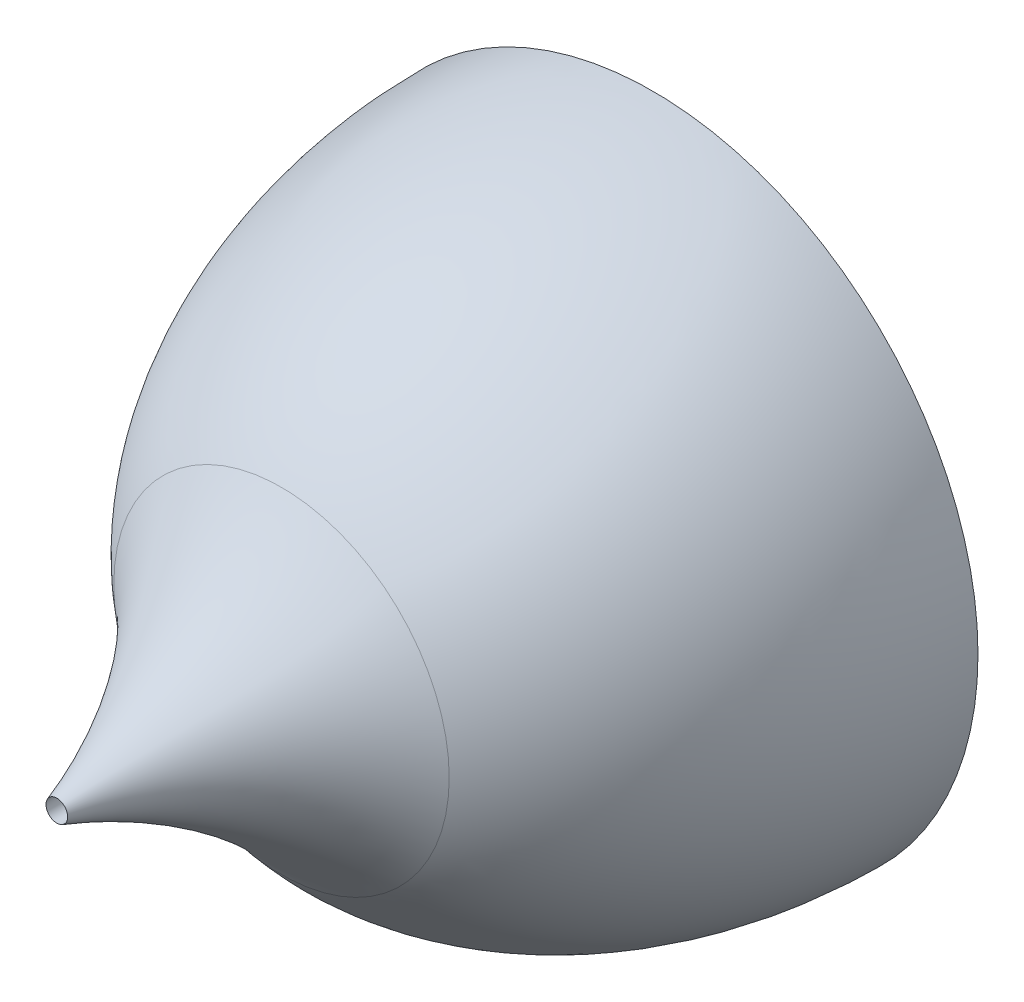
ISO-10303-21;
HEADER;
FILE_DESCRIPTION(('STEP AP214'),'2;1');
FILE_NAME('part.step','',(''),(''),'','','');
FILE_SCHEMA(('AUTOMOTIVE_DESIGN { 1 0 10303 214 1 1 1 1 }'));
ENDSEC;
DATA;
#1=APPLICATION_CONTEXT('core data for automotive mechanical design processes');
#2=APPLICATION_PROTOCOL_DEFINITION('international standard','automotive_design',2000,#1);
#3=PRODUCT_CONTEXT('',#1,'mechanical');
#4=PRODUCT('Part','Part','',(#3));
#5=PRODUCT_RELATED_PRODUCT_CATEGORY('part','',(#4));
#6=PRODUCT_DEFINITION_FORMATION('','',#4);
#7=PRODUCT_DEFINITION_CONTEXT('part definition',#1,'design');
#8=PRODUCT_DEFINITION('design','',#6,#7);
#9=PRODUCT_DEFINITION_SHAPE('','',#8);
#10=(LENGTH_UNIT() NAMED_UNIT(*) SI_UNIT(.MILLI.,.METRE.));
#11=(NAMED_UNIT(*) PLANE_ANGLE_UNIT() SI_UNIT($,.RADIAN.));
#12=(NAMED_UNIT(*) SI_UNIT($,.STERADIAN.) SOLID_ANGLE_UNIT());
#13=UNCERTAINTY_MEASURE_WITH_UNIT(LENGTH_MEASURE(1.E-05),#10,'distance_accuracy_value','');
#14=(GEOMETRIC_REPRESENTATION_CONTEXT(3) GLOBAL_UNCERTAINTY_ASSIGNED_CONTEXT((#13)) GLOBAL_UNIT_ASSIGNED_CONTEXT((#10,
#11,#12)) REPRESENTATION_CONTEXT('',''));
#15=CARTESIAN_POINT('',(0.,0.,0.));
#16=DIRECTION('',(0.,0.,1.));
#17=DIRECTION('',(1.,0.,0.));
#18=AXIS2_PLACEMENT_3D('',#15,#16,#17);
#19=CARTESIAN_POINT('',(0.,0.,0.));
#20=DIRECTION('',(0.,-1.,0.));
#21=DIRECTION('',(0.,0.,-1.));
#22=AXIS2_PLACEMENT_3D('',#19,#20,#21);
#23=ELLIPSE('',#22,17.,12.);
#24=TRIMMED_CURVE('',#23,(PARAMETER_VALUE(3.14159265358979)),
(PARAMETER_VALUE(6.28318530717959)),.T.,.PARAMETER.);
#25=CARTESIAN_POINT('',(0.,0.,-24.4808982426712));
#26=DIRECTION('',(0.,0.,-1.));
#27=AXIS1_PLACEMENT('',#25,#26);
#28=SURFACE_OF_REVOLUTION('',#24,#27);
#29=CARTESIAN_POINT('',(0.,0.,0.));
#30=DIRECTION('',(0.,0.,-1.));
#31=DIRECTION('',(-1.,0.,0.));
#32=AXIS2_PLACEMENT_3D('',#29,#30,#31);
#33=CIRCLE('',#32,12.);
#34=CARTESIAN_POINT('',(-12.,0.,0.));
#35=VERTEX_POINT('',#34);
#36=EDGE_CURVE('E10',#35,#35,#33,.T.);
#37=ORIENTED_EDGE('',*,*,#36,.T.);
#38=EDGE_LOOP('',(#37));
#39=FACE_BOUND('',#38,.T.);
#40=CARTESIAN_POINT('',(0.,0.,16.9852366450659));
#41=DIRECTION('',(0.,0.,-1.));
#42=DIRECTION('',(-1.,0.,0.));
#43=AXIS2_PLACEMENT_3D('',#40,#41,#42);
#44=CIRCLE('',#43,0.500000000000001);
#45=CARTESIAN_POINT('',(-0.5,0.,16.9852366450659));
#46=VERTEX_POINT('',#45);
#47=EDGE_CURVE('E50',#46,#46,#44,.T.);
#48=ORIENTED_EDGE('',*,*,#47,.F.);
#49=EDGE_LOOP('',(#48));
#50=FACE_BOUND('',#49,.T.);
#51=ADVANCED_FACE('F30',(#39,#50),#28,.F.);
#52=CARTESIAN_POINT('',(-15.,0.,0.));
#53=DIRECTION('',(0.,0.,-1.));
#54=DIRECTION('',(-1.,0.,0.));
#55=AXIS2_PLACEMENT_3D('',#52,#53,#54);
#56=PLANE('',#55);
#57=CARTESIAN_POINT('',(0.,0.,0.));
#58=DIRECTION('',(0.,0.,-1.));
#59=DIRECTION('',(-1.,0.,0.));
#60=AXIS2_PLACEMENT_3D('',#57,#58,#59);
#61=CIRCLE('',#60,15.);
#62=CARTESIAN_POINT('',(-15.,0.,0.));
#63=VERTEX_POINT('',#62);
#64=EDGE_CURVE('E37',#63,#63,#61,.T.);
#65=ORIENTED_EDGE('',*,*,#64,.T.);
#66=EDGE_LOOP('',(#65));
#67=FACE_BOUND('',#66,.T.);
#68=ORIENTED_EDGE('',*,*,#36,.F.);
#69=EDGE_LOOP('',(#68));
#70=FACE_BOUND('',#69,.T.);
#71=ADVANCED_FACE('F60',(#67,#70),#56,.T.);
#72=CARTESIAN_POINT('',(0.,0.,0.));
#73=DIRECTION('',(0.,1.,0.));
#74=DIRECTION('',(0.,0.,1.));
#75=AXIS2_PLACEMENT_3D('',#72,#73,#74);
#76=ELLIPSE('',#75,20.,15.);
#77=TRIMMED_CURVE('',#76,(PARAMETER_VALUE(3.14159265358979)),
(PARAMETER_VALUE(6.28318530717959)),.T.,.PARAMETER.);
#78=CARTESIAN_POINT('',(0.,0.,-24.4808982426712));
#79=DIRECTION('',(0.,0.,-1.));
#80=AXIS1_PLACEMENT('',#78,#79);
#81=SURFACE_OF_REVOLUTION('',#77,#80);
#82=CARTESIAN_POINT('',(0.,0.,17.1335443860057));
#83=DIRECTION('',(0.,0.,-1.));
#84=DIRECTION('',(-1.,0.,0.));
#85=AXIS2_PLACEMENT_3D('',#82,#83,#84);
#86=CIRCLE('',#85,7.73779244582623);
#87=CARTESIAN_POINT('',(-7.73779244582623,0.,17.1335443860057));
#88=VERTEX_POINT('',#87);
#89=EDGE_CURVE('E41',#88,#88,#86,.T.);
#90=ORIENTED_EDGE('',*,*,#89,.T.);
#91=EDGE_LOOP('',(#90));
#92=FACE_BOUND('',#91,.T.);
#93=ORIENTED_EDGE('',*,*,#64,.F.);
#94=EDGE_LOOP('',(#93));
#95=FACE_BOUND('',#94,.T.);
#96=ADVANCED_FACE('F56',(#92,#95),#81,.F.);
#97=CARTESIAN_POINT('',(0.,0.,34.6784694956438));
#98=DIRECTION('',(0.,0.,-1.));
#99=DIRECTION('',(-1.,0.,0.));
#100=AXIS2_PLACEMENT_3D('',#97,#98,#99);
#101=DEGENERATE_TOROIDAL_SURFACE('',#100,21.8241547476126,22.5000000000002,.T.);
#102=CARTESIAN_POINT('',(0.,0.,27.5000000000001));
#103=DIRECTION('',(0.,0.,-1.));
#104=DIRECTION('',(-1.,0.,0.));
#105=AXIS2_PLACEMENT_3D('',#102,#103,#104);
#106=CIRCLE('',#105,0.500000000000192);
#107=CARTESIAN_POINT('',(-0.500000000000191,0.,27.5000000000001));
#108=VERTEX_POINT('',#107);
#109=EDGE_CURVE('E45',#108,#108,#106,.T.);
#110=ORIENTED_EDGE('',*,*,#109,.T.);
#111=EDGE_LOOP('',(#110));
#112=FACE_BOUND('',#111,.T.);
#113=ORIENTED_EDGE('',*,*,#89,.F.);
#114=EDGE_LOOP('',(#113));
#115=FACE_BOUND('',#114,.T.);
#116=ADVANCED_FACE('F59',(#112,#115),#101,.F.);
#117=CARTESIAN_POINT('',(0.,0.,-24.4808982426712));
#118=DIRECTION('',(0.,0.,-1.));
#119=DIRECTION('',(-1.,0.,0.));
#120=AXIS2_PLACEMENT_3D('',#117,#118,#119);
#121=CYLINDRICAL_SURFACE('',#120,0.500000000000097);
#122=ORIENTED_EDGE('',*,*,#47,.T.);
#123=EDGE_LOOP('',(#122));
#124=FACE_BOUND('',#123,.T.);
#125=ORIENTED_EDGE('',*,*,#109,.F.);
#126=EDGE_LOOP('',(#125));
#127=FACE_BOUND('',#126,.T.);
#128=ADVANCED_FACE('F73',(#124,#127),#121,.F.);
#129=CLOSED_SHELL('',(#51,#71,#96,#116,#128));
#130=MANIFOLD_SOLID_BREP('B2',#129);
#131=ADVANCED_BREP_SHAPE_REPRESENTATION('',(#18,#130),#14);
#132=SHAPE_DEFINITION_REPRESENTATION(#9,#131);
ENDSEC;
END-ISO-10303-21;
